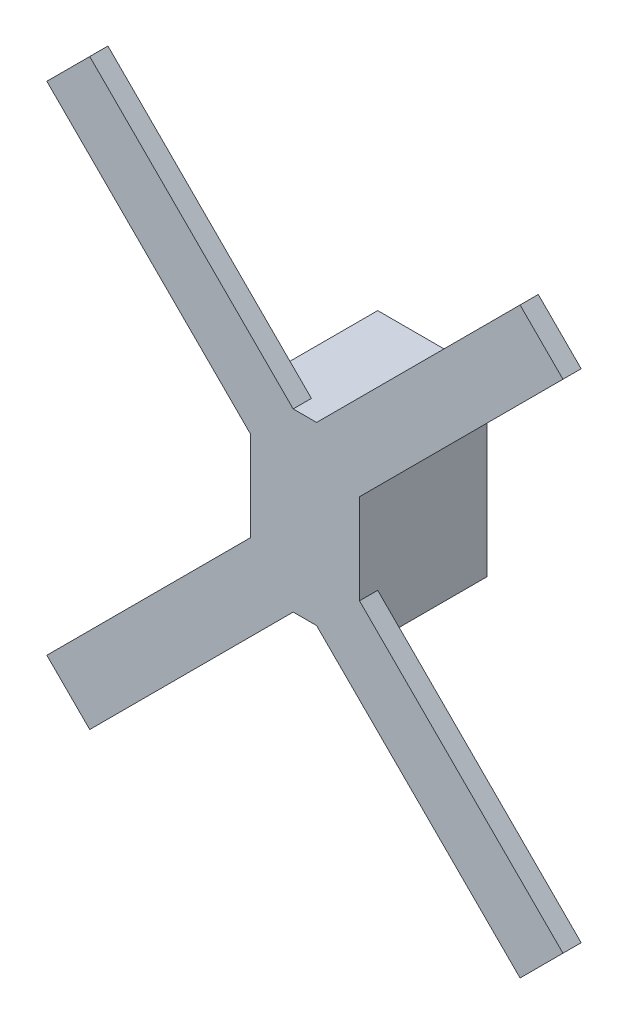
ISO-10303-21;
HEADER;
FILE_DESCRIPTION(('STEP AP214'),'2;1');
FILE_NAME('part.step','',(''),(''),'','','');
FILE_SCHEMA(('AUTOMOTIVE_DESIGN { 1 0 10303 214 1 1 1 1 }'));
ENDSEC;
DATA;
#1=APPLICATION_CONTEXT('core data for automotive mechanical design processes');
#2=APPLICATION_PROTOCOL_DEFINITION('international standard','automotive_design',2000,#1);
#3=PRODUCT_CONTEXT('',#1,'mechanical');
#4=PRODUCT('Part','Part','',(#3));
#5=PRODUCT_RELATED_PRODUCT_CATEGORY('part','',(#4));
#6=PRODUCT_DEFINITION_FORMATION('','',#4);
#7=PRODUCT_DEFINITION_CONTEXT('part definition',#1,'design');
#8=PRODUCT_DEFINITION('design','',#6,#7);
#9=PRODUCT_DEFINITION_SHAPE('','',#8);
#10=(LENGTH_UNIT() NAMED_UNIT(*) SI_UNIT(.MILLI.,.METRE.));
#11=(NAMED_UNIT(*) PLANE_ANGLE_UNIT() SI_UNIT($,.RADIAN.));
#12=(NAMED_UNIT(*) SI_UNIT($,.STERADIAN.) SOLID_ANGLE_UNIT());
#13=UNCERTAINTY_MEASURE_WITH_UNIT(LENGTH_MEASURE(1.E-05),#10,'distance_accuracy_value','');
#14=(GEOMETRIC_REPRESENTATION_CONTEXT(3) GLOBAL_UNCERTAINTY_ASSIGNED_CONTEXT((#13)) GLOBAL_UNIT_ASSIGNED_CONTEXT((#10,
#11,#12)) REPRESENTATION_CONTEXT('',''));
#15=CARTESIAN_POINT('',(0.,0.,0.));
#16=DIRECTION('',(0.,0.,1.));
#17=DIRECTION('',(1.,0.,0.));
#18=AXIS2_PLACEMENT_3D('',#15,#16,#17);
#19=CARTESIAN_POINT('',(-24.2652702511118,-2.501993067591,21.));
#20=DIRECTION('',(1.,0.,0.));
#21=DIRECTION('',(0.,0.,-1.));
#22=AXIS2_PLACEMENT_3D('',#19,#20,#21);
#23=PLANE('',#22);
#24=DIRECTION('',(0.,0.,-1.));
#25=VECTOR('',#24,1.);
#26=CARTESIAN_POINT('',(-24.2652702511118,-2.501993067591,21.));
#27=LINE('',#26,#25);
#28=CARTESIAN_POINT('',(-24.2652702511118,-2.501993067591,19.));
#29=VERTEX_POINT('',#28);
#30=CARTESIAN_POINT('',(-24.2652702511118,-2.501993067591,0.));
#31=VERTEX_POINT('',#30);
#32=EDGE_CURVE('E249',#29,#31,#27,.T.);
#33=ORIENTED_EDGE('',*,*,#32,.F.);
#34=DIRECTION('',(0.,-1.,0.));
#35=VECTOR('',#34,1.);
#36=CARTESIAN_POINT('',(-24.2652702511118,-2.501993067591,19.));
#37=LINE('',#36,#35);
#38=CARTESIAN_POINT('',(-24.2652702511118,-27.501993067591,19.));
#39=VERTEX_POINT('',#38);
#40=EDGE_CURVE('E272',#29,#39,#37,.T.);
#41=ORIENTED_EDGE('',*,*,#40,.T.);
#42=DIRECTION('',(0.,0.,-1.));
#43=VECTOR('',#42,1.);
#44=CARTESIAN_POINT('',(-24.2652702511118,-27.501993067591,21.));
#45=LINE('',#44,#43);
#46=CARTESIAN_POINT('',(-24.2652702511118,-27.501993067591,0.));
#47=VERTEX_POINT('',#46);
#48=EDGE_CURVE('E236',#39,#47,#45,.T.);
#49=ORIENTED_EDGE('',*,*,#48,.T.);
#50=DIRECTION('',(0.,-1.,0.));
#51=VECTOR('',#50,1.);
#52=CARTESIAN_POINT('',(-24.2652702511118,-2.501993067591,0.));
#53=LINE('',#52,#51);
#54=EDGE_CURVE('E260',#31,#47,#53,.T.);
#55=ORIENTED_EDGE('',*,*,#54,.F.);
#56=EDGE_LOOP('',(#33,#41,#49,#55));
#57=FACE_BOUND('',#56,.T.);
#58=ADVANCED_FACE('F33',(#57),#23,.T.);
#59=CARTESIAN_POINT('',(-24.2652702511118,-27.501993067591,21.));
#60=DIRECTION('',(0.,1.,0.));
#61=DIRECTION('',(0.,0.,1.));
#62=AXIS2_PLACEMENT_3D('',#59,#60,#61);
#63=PLANE('',#62);
#64=ORIENTED_EDGE('',*,*,#48,.F.);
#65=DIRECTION('',(1.,0.,0.));
#66=VECTOR('',#65,1.);
#67=CARTESIAN_POINT('',(-24.2652702511118,-27.501993067591,19.));
#68=LINE('',#67,#66);
#69=CARTESIAN_POINT('',(-10.2652702511118,-27.501993067591,19.));
#70=VERTEX_POINT('',#69);
#71=EDGE_CURVE('E269',#39,#70,#68,.T.);
#72=ORIENTED_EDGE('',*,*,#71,.T.);
#73=DIRECTION('',(0.,0.,-1.));
#74=VECTOR('',#73,1.);
#75=CARTESIAN_POINT('',(-10.2652702511118,-27.501993067591,21.));
#76=LINE('',#75,#74);
#77=CARTESIAN_POINT('',(-10.2652702511118,-27.501993067591,0.));
#78=VERTEX_POINT('',#77);
#79=EDGE_CURVE('E245',#70,#78,#76,.T.);
#80=ORIENTED_EDGE('',*,*,#79,.T.);
#81=DIRECTION('',(1.,0.,0.));
#82=VECTOR('',#81,1.);
#83=CARTESIAN_POINT('',(-24.2652702511118,-27.501993067591,0.));
#84=LINE('',#83,#82);
#85=EDGE_CURVE('E257',#47,#78,#84,.T.);
#86=ORIENTED_EDGE('',*,*,#85,.F.);
#87=EDGE_LOOP('',(#64,#72,#80,#86));
#88=FACE_BOUND('',#87,.T.);
#89=ADVANCED_FACE('F462',(#88),#63,.T.);
#90=CARTESIAN_POINT('',(-10.2652702511118,-2.501993067591,21.));
#91=DIRECTION('',(-1.,0.,0.));
#92=DIRECTION('',(0.,-1.,0.));
#93=AXIS2_PLACEMENT_3D('',#90,#91,#92);
#94=PLANE('',#93);
#95=ORIENTED_EDGE('',*,*,#79,.F.);
#96=DIRECTION('',(0.,1.,0.));
#97=VECTOR('',#96,1.);
#98=CARTESIAN_POINT('',(-10.2652702511118,-2.501993067591,19.));
#99=LINE('',#98,#97);
#100=CARTESIAN_POINT('',(-10.2652702511118,-2.501993067591,19.));
#101=VERTEX_POINT('',#100);
#102=EDGE_CURVE('E266',#70,#101,#99,.T.);
#103=ORIENTED_EDGE('',*,*,#102,.T.);
#104=DIRECTION('',(0.,0.,-1.));
#105=VECTOR('',#104,1.);
#106=CARTESIAN_POINT('',(-10.2652702511118,-2.501993067591,21.));
#107=LINE('',#106,#105);
#108=CARTESIAN_POINT('',(-10.2652702511118,-2.501993067591,0.));
#109=VERTEX_POINT('',#108);
#110=EDGE_CURVE('E247',#101,#109,#107,.T.);
#111=ORIENTED_EDGE('',*,*,#110,.T.);
#112=DIRECTION('',(0.,1.,0.));
#113=VECTOR('',#112,1.);
#114=CARTESIAN_POINT('',(-10.2652702511118,-2.501993067591,0.));
#115=LINE('',#114,#113);
#116=EDGE_CURVE('E254',#78,#109,#115,.T.);
#117=ORIENTED_EDGE('',*,*,#116,.F.);
#118=EDGE_LOOP('',(#95,#103,#111,#117));
#119=FACE_BOUND('',#118,.T.);
#120=ADVANCED_FACE('F466',(#119),#94,.T.);
#121=CARTESIAN_POINT('',(-24.2652702511118,-2.501993067591,21.));
#122=DIRECTION('',(0.,-1.,0.));
#123=DIRECTION('',(0.,0.,-1.));
#124=AXIS2_PLACEMENT_3D('',#121,#122,#123);
#125=PLANE('',#124);
#126=ORIENTED_EDGE('',*,*,#110,.F.);
#127=DIRECTION('',(-1.,0.,0.));
#128=VECTOR('',#127,1.);
#129=CARTESIAN_POINT('',(-24.2652702511118,-2.501993067591,19.));
#130=LINE('',#129,#128);
#131=EDGE_CURVE('E263',#101,#29,#130,.T.);
#132=ORIENTED_EDGE('',*,*,#131,.T.);
#133=ORIENTED_EDGE('',*,*,#32,.T.);
#134=DIRECTION('',(-1.,0.,0.));
#135=VECTOR('',#134,1.);
#136=CARTESIAN_POINT('',(-24.2652702511118,-2.501993067591,0.));
#137=LINE('',#136,#135);
#138=EDGE_CURVE('E251',#109,#31,#137,.T.);
#139=ORIENTED_EDGE('',*,*,#138,.F.);
#140=EDGE_LOOP('',(#126,#132,#133,#139));
#141=FACE_BOUND('',#140,.T.);
#142=ADVANCED_FACE('F469',(#141),#125,.T.);
#143=CARTESIAN_POINT('',(0.,0.,21.));
#144=DIRECTION('',(0.,0.,1.));
#145=DIRECTION('',(1.,0.,0.));
#146=AXIS2_PLACEMENT_3D('',#143,#144,#145);
#147=PLANE('',#146);
#148=DIRECTION('',(0.,-1.,0.));
#149=VECTOR('',#148,1.);
#150=CARTESIAN_POINT('',(-26.2652702511118,-2.501993067591,21.));
#151=LINE('',#150,#149);
#152=CARTESIAN_POINT('',(-26.2652702511118,-7.57306087945565,21.));
#153=VERTEX_POINT('',#152);
#154=CARTESIAN_POINT('',(-26.2652702511118,-22.4309252557213,21.));
#155=VERTEX_POINT('',#154);
#156=EDGE_CURVE('E238',#153,#155,#151,.T.);
#157=ORIENTED_EDGE('',*,*,#156,.T.);
#158=DIRECTION('',(-0.707106781186546,-0.707106781186549,0.));
#159=VECTOR('',#158,1.);
#160=CARTESIAN_POINT('',(-59.800804157045,-55.9664591616546,21.));
#161=LINE('',#160,#159);
#162=CARTESIAN_POINT('',(-59.800804157045,-55.9664591616546,21.));
#163=VERTEX_POINT('',#162);
#164=EDGE_CURVE('E381',#155,#163,#161,.T.);
#165=ORIENTED_EDGE('',*,*,#164,.T.);
#166=DIRECTION('',(0.707106781186549,-0.707106781186546,0.));
#167=VECTOR('',#166,1.);
#168=CARTESIAN_POINT('',(-56.265270251112,-59.5019930675874,21.));
#169=LINE('',#168,#167);
#170=CARTESIAN_POINT('',(-52.7297363451791,-63.0375269735203,21.));
#171=VERTEX_POINT('',#170);
#172=EDGE_CURVE('E379',#163,#171,#169,.T.);
#173=ORIENTED_EDGE('',*,*,#172,.T.);
#174=DIRECTION('',(0.707106781186547,0.707106781186548,0.));
#175=VECTOR('',#174,1.);
#176=CARTESIAN_POINT('',(-19.1942024392499,-29.501993067591,21.));
#177=LINE('',#176,#175);
#178=CARTESIAN_POINT('',(-19.1942024392499,-29.501993067591,21.));
#179=VERTEX_POINT('',#178);
#180=EDGE_CURVE('E48',#171,#179,#177,.T.);
#181=ORIENTED_EDGE('',*,*,#180,.T.);
#182=DIRECTION('',(1.,0.,0.));
#183=VECTOR('',#182,1.);
#184=CARTESIAN_POINT('',(-26.2652702511118,-29.501993067591,21.));
#185=LINE('',#184,#183);
#186=CARTESIAN_POINT('',(-15.3363380629771,-29.501993067591,21.));
#187=VERTEX_POINT('',#186);
#188=EDGE_CURVE('E223',#179,#187,#185,.T.);
#189=ORIENTED_EDGE('',*,*,#188,.T.);
#190=DIRECTION('',(0.707106781186548,-0.707106781186547,0.));
#191=VECTOR('',#190,1.);
#192=CARTESIAN_POINT('',(18.1991958429563,-63.0375269735244,21.));
#193=LINE('',#192,#191);
#194=CARTESIAN_POINT('',(18.1991958429563,-63.0375269735244,21.));
#195=VERTEX_POINT('',#194);
#196=EDGE_CURVE('E354',#187,#195,#193,.T.);
#197=ORIENTED_EDGE('',*,*,#196,.T.);
#198=DIRECTION('',(0.707106781186547,0.707106781186548,0.));
#199=VECTOR('',#198,1.);
#200=CARTESIAN_POINT('',(25.2702636548226,-55.966459161658,21.));
#201=LINE('',#200,#199);
#202=CARTESIAN_POINT('',(25.2702636548226,-55.966459161658,21.));
#203=VERTEX_POINT('',#202);
#204=EDGE_CURVE('E351',#195,#203,#201,.T.);
#205=ORIENTED_EDGE('',*,*,#204,.T.);
#206=DIRECTION('',(-0.707106781186548,0.707106781186547,0.));
#207=VECTOR('',#206,1.);
#208=CARTESIAN_POINT('',(25.2702636548226,-55.966459161658,21.));
#209=LINE('',#208,#207);
#210=CARTESIAN_POINT('',(-8.2652702511118,-22.4309252557236,21.));
#211=VERTEX_POINT('',#210);
#212=EDGE_CURVE('E347',#203,#211,#209,.T.);
#213=ORIENTED_EDGE('',*,*,#212,.T.);
#214=DIRECTION('',(0.,1.,0.));
#215=VECTOR('',#214,1.);
#216=CARTESIAN_POINT('',(-8.2652702511118,-29.501993067591,21.));
#217=LINE('',#216,#215);
#218=CARTESIAN_POINT('',(-8.2652702511118,-7.57306087945814,21.));
#219=VERTEX_POINT('',#218);
#220=EDGE_CURVE('E228',#211,#219,#217,.T.);
#221=ORIENTED_EDGE('',*,*,#220,.T.);
#222=DIRECTION('',(0.707106781186548,0.707106781186547,0.));
#223=VECTOR('',#222,1.);
#224=CARTESIAN_POINT('',(25.2702636548226,25.9624730264762,21.));
#225=LINE('',#224,#223);
#226=CARTESIAN_POINT('',(25.2702636548226,25.9624730264762,21.));
#227=VERTEX_POINT('',#226);
#228=EDGE_CURVE('E293',#219,#227,#225,.T.);
#229=ORIENTED_EDGE('',*,*,#228,.T.);
#230=DIRECTION('',(-0.707106781186547,0.707106781186548,0.));
#231=VECTOR('',#230,1.);
#232=CARTESIAN_POINT('',(21.7347297488902,29.4980069324086,21.));
#233=LINE('',#232,#231);
#234=CARTESIAN_POINT('',(18.1991958429563,33.0335408383425,21.));
#235=VERTEX_POINT('',#234);
#236=EDGE_CURVE('E290',#227,#235,#233,.T.);
#237=ORIENTED_EDGE('',*,*,#236,.T.);
#238=DIRECTION('',(-0.707106781186543,-0.707106781186552,0.));
#239=VECTOR('',#238,1.);
#240=CARTESIAN_POINT('',(18.1991958429563,33.0335408383425,21.));
#241=LINE('',#240,#239);
#242=CARTESIAN_POINT('',(-15.3363380629769,-0.501993067591003,21.));
#243=VERTEX_POINT('',#242);
#244=EDGE_CURVE('E287',#235,#243,#241,.T.);
#245=ORIENTED_EDGE('',*,*,#244,.T.);
#246=DIRECTION('',(-1.,0.,0.));
#247=VECTOR('',#246,1.);
#248=CARTESIAN_POINT('',(-8.2652702511118,-0.501993067591003,21.));
#249=LINE('',#248,#247);
#250=CARTESIAN_POINT('',(-19.1942024392448,-0.501993067591003,21.));
#251=VERTEX_POINT('',#250);
#252=EDGE_CURVE('E240',#243,#251,#249,.T.);
#253=ORIENTED_EDGE('',*,*,#252,.T.);
#254=DIRECTION('',(-0.707106781186547,0.707106781186548,0.));
#255=VECTOR('',#254,1.);
#256=CARTESIAN_POINT('',(-52.7297363451782,33.0335408383425,21.));
#257=LINE('',#256,#255);
#258=CARTESIAN_POINT('',(-52.7297363451782,33.0335408383425,21.));
#259=VERTEX_POINT('',#258);
#260=EDGE_CURVE('E322',#251,#259,#257,.T.);
#261=ORIENTED_EDGE('',*,*,#260,.T.);
#262=DIRECTION('',(-0.707106781186548,-0.707106781186548,0.));
#263=VECTOR('',#262,1.);
#264=CARTESIAN_POINT('',(-56.2652702511076,29.4980069324132,21.));
#265=LINE('',#264,#263);
#266=CARTESIAN_POINT('',(-59.8008041570445,25.9624730264762,21.));
#267=VERTEX_POINT('',#266);
#268=EDGE_CURVE('E320',#259,#267,#265,.T.);
#269=ORIENTED_EDGE('',*,*,#268,.T.);
#270=DIRECTION('',(0.707106781186556,-0.707106781186539,0.));
#271=VECTOR('',#270,1.);
#272=CARTESIAN_POINT('',(-59.8008041570445,25.9624730264762,21.));
#273=LINE('',#272,#271);
#274=EDGE_CURVE('E55',#267,#153,#273,.T.);
#275=ORIENTED_EDGE('',*,*,#274,.T.);
#276=EDGE_LOOP('',(#157,#165,#173,#181,#189,#197,#205,#213,#221,#229,#237,#245,#253,#261,#269,#275));
#277=FACE_BOUND('',#276,.T.);
#278=ADVANCED_FACE('F391',(#277),#147,.T.);
#279=CARTESIAN_POINT('',(0.,0.,0.));
#280=DIRECTION('',(0.,0.,1.));
#281=DIRECTION('',(1.,0.,0.));
#282=AXIS2_PLACEMENT_3D('',#279,#280,#281);
#283=PLANE('',#282);
#284=DIRECTION('',(0.,1.,0.));
#285=VECTOR('',#284,1.);
#286=CARTESIAN_POINT('',(-8.2652702511118,-27.501993067591,0.));
#287=LINE('',#286,#285);
#288=CARTESIAN_POINT('',(-8.2652702511118,-29.501993067591,0.));
#289=VERTEX_POINT('',#288);
#290=CARTESIAN_POINT('',(-8.2652702511118,-0.501993067591003,0.));
#291=VERTEX_POINT('',#290);
#292=EDGE_CURVE('E233',#289,#291,#287,.T.);
#293=ORIENTED_EDGE('',*,*,#292,.F.);
#294=DIRECTION('',(1.,0.,0.));
#295=VECTOR('',#294,1.);
#296=CARTESIAN_POINT('',(-10.2652702511118,-29.501993067591,0.));
#297=LINE('',#296,#295);
#298=CARTESIAN_POINT('',(-26.2652702511118,-29.501993067591,0.));
#299=VERTEX_POINT('',#298);
#300=EDGE_CURVE('E226',#299,#289,#297,.T.);
#301=ORIENTED_EDGE('',*,*,#300,.F.);
#302=DIRECTION('',(0.,-1.,0.));
#303=VECTOR('',#302,1.);
#304=CARTESIAN_POINT('',(-26.2652702511118,-2.501993067591,0.));
#305=LINE('',#304,#303);
#306=CARTESIAN_POINT('',(-26.2652702511118,-0.501993067591003,0.));
#307=VERTEX_POINT('',#306);
#308=EDGE_CURVE('E220',#307,#299,#305,.T.);
#309=ORIENTED_EDGE('',*,*,#308,.F.);
#310=DIRECTION('',(-1.,0.,0.));
#311=VECTOR('',#310,1.);
#312=CARTESIAN_POINT('',(-26.2652702511118,-0.501993067591003,0.));
#313=LINE('',#312,#311);
#314=EDGE_CURVE('E230',#291,#307,#313,.T.);
#315=ORIENTED_EDGE('',*,*,#314,.F.);
#316=EDGE_LOOP('',(#293,#301,#309,#315));
#317=FACE_BOUND('',#316,.T.);
#318=ORIENTED_EDGE('',*,*,#54,.T.);
#319=ORIENTED_EDGE('',*,*,#85,.T.);
#320=ORIENTED_EDGE('',*,*,#116,.T.);
#321=ORIENTED_EDGE('',*,*,#138,.T.);
#322=EDGE_LOOP('',(#318,#319,#320,#321));
#323=FACE_BOUND('',#322,.T.);
#324=ADVANCED_FACE('F451',(#317,#323),#283,.F.);
#325=CARTESIAN_POINT('',(-8.2652702511118,-27.501993067591,21.));
#326=DIRECTION('',(-1.,0.,0.));
#327=DIRECTION('',(0.,0.,1.));
#328=AXIS2_PLACEMENT_3D('',#325,#326,#327);
#329=PLANE('',#328);
#330=ORIENTED_EDGE('',*,*,#220,.F.);
#331=DIRECTION('',(0.,0.,1.));
#332=VECTOR('',#331,1.);
#333=CARTESIAN_POINT('',(-8.2652702511118,-22.4309252557236,18.));
#334=LINE('',#333,#332);
#335=CARTESIAN_POINT('',(-8.2652702511118,-22.4309252557236,18.));
#336=VERTEX_POINT('',#335);
#337=EDGE_CURVE('E325',#336,#211,#334,.T.);
#338=ORIENTED_EDGE('',*,*,#337,.F.);
#339=DIRECTION('',(0.,-1.,0.));
#340=VECTOR('',#339,1.);
#341=CARTESIAN_POINT('',(-8.2652702511118,-22.4309252557236,18.));
#342=LINE('',#341,#340);
#343=CARTESIAN_POINT('',(-8.2652702511118,-29.501993067591,18.));
#344=VERTEX_POINT('',#343);
#345=EDGE_CURVE('E350',#336,#344,#342,.T.);
#346=ORIENTED_EDGE('',*,*,#345,.T.);
#347=DIRECTION('',(0.,0.,-1.));
#348=VECTOR('',#347,1.);
#349=CARTESIAN_POINT('',(-8.2652702511118,-29.501993067591,21.));
#350=LINE('',#349,#348);
#351=EDGE_CURVE('E221',#344,#289,#350,.T.);
#352=ORIENTED_EDGE('',*,*,#351,.T.);
#353=ORIENTED_EDGE('',*,*,#292,.T.);
#354=DIRECTION('',(0.,0.,-1.));
#355=VECTOR('',#354,1.);
#356=CARTESIAN_POINT('',(-8.2652702511118,-0.501993067591003,21.));
#357=LINE('',#356,#355);
#358=CARTESIAN_POINT('',(-8.2652702511118,-0.501993067591003,18.));
#359=VERTEX_POINT('',#358);
#360=EDGE_CURVE('E11',#359,#291,#357,.T.);
#361=ORIENTED_EDGE('',*,*,#360,.F.);
#362=DIRECTION('',(0.,-1.,0.));
#363=VECTOR('',#362,1.);
#364=CARTESIAN_POINT('',(-8.2652702511118,-7.57306087945814,18.));
#365=LINE('',#364,#363);
#366=CARTESIAN_POINT('',(-8.2652702511118,-7.57306087945814,18.));
#367=VERTEX_POINT('',#366);
#368=EDGE_CURVE('E289',#359,#367,#365,.T.);
#369=ORIENTED_EDGE('',*,*,#368,.T.);
#370=DIRECTION('',(0.,0.,1.));
#371=VECTOR('',#370,1.);
#372=CARTESIAN_POINT('',(-8.2652702511118,-7.57306087945814,18.));
#373=LINE('',#372,#371);
#374=EDGE_CURVE('E276',#367,#219,#373,.T.);
#375=ORIENTED_EDGE('',*,*,#374,.T.);
#376=EDGE_LOOP('',(#330,#338,#346,#352,#353,#361,#369,#375));
#377=FACE_BOUND('',#376,.T.);
#378=ADVANCED_FACE('F35',(#377),#329,.F.);
#379=CARTESIAN_POINT('',(-26.2652702511118,-0.501993067591003,21.));
#380=DIRECTION('',(0.,-1.,0.));
#381=DIRECTION('',(0.,0.,-1.));
#382=AXIS2_PLACEMENT_3D('',#379,#380,#381);
#383=PLANE('',#382);
#384=DIRECTION('',(1.,0.,0.));
#385=VECTOR('',#384,1.);
#386=CARTESIAN_POINT('',(-26.2652702511118,-0.501993067591003,18.));
#387=LINE('',#386,#385);
#388=CARTESIAN_POINT('',(-26.2652702511118,-0.501993067591003,18.));
#389=VERTEX_POINT('',#388);
#390=CARTESIAN_POINT('',(-19.1942024392448,-0.501993067591003,18.));
#391=VERTEX_POINT('',#390);
#392=EDGE_CURVE('E319',#389,#391,#387,.T.);
#393=ORIENTED_EDGE('',*,*,#392,.T.);
#394=DIRECTION('',(0.,0.,1.));
#395=VECTOR('',#394,1.);
#396=CARTESIAN_POINT('',(-19.1942024392448,-0.501993067591003,18.));
#397=LINE('',#396,#395);
#398=EDGE_CURVE('E308',#391,#251,#397,.T.);
#399=ORIENTED_EDGE('',*,*,#398,.T.);
#400=ORIENTED_EDGE('',*,*,#252,.F.);
#401=DIRECTION('',(0.,0.,1.));
#402=VECTOR('',#401,1.);
#403=CARTESIAN_POINT('',(-15.3363380629769,-0.501993067591003,18.));
#404=LINE('',#403,#402);
#405=CARTESIAN_POINT('',(-15.3363380629769,-0.501993067591003,18.));
#406=VERTEX_POINT('',#405);
#407=EDGE_CURVE('E275',#406,#243,#404,.T.);
#408=ORIENTED_EDGE('',*,*,#407,.F.);
#409=DIRECTION('',(1.,0.,0.));
#410=VECTOR('',#409,1.);
#411=CARTESIAN_POINT('',(-15.3363380629769,-0.501993067591003,18.));
#412=LINE('',#411,#410);
#413=EDGE_CURVE('E280',#406,#359,#412,.T.);
#414=ORIENTED_EDGE('',*,*,#413,.T.);
#415=ORIENTED_EDGE('',*,*,#360,.T.);
#416=ORIENTED_EDGE('',*,*,#314,.T.);
#417=DIRECTION('',(0.,0.,-1.));
#418=VECTOR('',#417,1.);
#419=CARTESIAN_POINT('',(-26.2652702511118,-0.501993067591003,21.));
#420=LINE('',#419,#418);
#421=EDGE_CURVE('E41',#389,#307,#420,.T.);
#422=ORIENTED_EDGE('',*,*,#421,.F.);
#423=EDGE_LOOP('',(#393,#399,#400,#408,#414,#415,#416,#422));
#424=FACE_BOUND('',#423,.T.);
#425=ADVANCED_FACE('F432',(#424),#383,.F.);
#426=CARTESIAN_POINT('',(-26.2652702511118,-2.501993067591,21.));
#427=DIRECTION('',(1.,0.,0.));
#428=DIRECTION('',(0.,0.,-1.));
#429=AXIS2_PLACEMENT_3D('',#426,#427,#428);
#430=PLANE('',#429);
#431=DIRECTION('',(0.,1.,0.));
#432=VECTOR('',#431,1.);
#433=CARTESIAN_POINT('',(-26.2652702511118,-22.4309252557213,18.));
#434=LINE('',#433,#432);
#435=CARTESIAN_POINT('',(-26.2652702511118,-29.501993067591,18.));
#436=VERTEX_POINT('',#435);
#437=CARTESIAN_POINT('',(-26.2652702511118,-22.4309252557213,18.));
#438=VERTEX_POINT('',#437);
#439=EDGE_CURVE('E195',#436,#438,#434,.T.);
#440=ORIENTED_EDGE('',*,*,#439,.T.);
#441=DIRECTION('',(0.,0.,1.));
#442=VECTOR('',#441,1.);
#443=CARTESIAN_POINT('',(-26.2652702511118,-22.4309252557213,18.));
#444=LINE('',#443,#442);
#445=EDGE_CURVE('E369',#438,#155,#444,.T.);
#446=ORIENTED_EDGE('',*,*,#445,.T.);
#447=ORIENTED_EDGE('',*,*,#156,.F.);
#448=DIRECTION('',(0.,0.,1.));
#449=VECTOR('',#448,1.);
#450=CARTESIAN_POINT('',(-26.2652702511118,-7.57306087945565,18.));
#451=LINE('',#450,#449);
#452=CARTESIAN_POINT('',(-26.2652702511118,-7.57306087945565,18.));
#453=VERTEX_POINT('',#452);
#454=EDGE_CURVE('E296',#453,#153,#451,.T.);
#455=ORIENTED_EDGE('',*,*,#454,.F.);
#456=DIRECTION('',(0.,1.,0.));
#457=VECTOR('',#456,1.);
#458=CARTESIAN_POINT('',(-26.2652702511118,-7.57306087945565,18.));
#459=LINE('',#458,#457);
#460=EDGE_CURVE('E312',#453,#389,#459,.T.);
#461=ORIENTED_EDGE('',*,*,#460,.T.);
#462=ORIENTED_EDGE('',*,*,#421,.T.);
#463=ORIENTED_EDGE('',*,*,#308,.T.);
#464=DIRECTION('',(0.,0.,-1.));
#465=VECTOR('',#464,1.);
#466=CARTESIAN_POINT('',(-26.2652702511118,-29.501993067591,21.));
#467=LINE('',#466,#465);
#468=EDGE_CURVE('E213',#436,#299,#467,.T.);
#469=ORIENTED_EDGE('',*,*,#468,.F.);
#470=EDGE_LOOP('',(#440,#446,#447,#455,#461,#462,#463,#469));
#471=FACE_BOUND('',#470,.T.);
#472=ADVANCED_FACE('F218',(#471),#430,.F.);
#473=CARTESIAN_POINT('',(-10.2652702511118,-29.501993067591,21.));
#474=DIRECTION('',(0.,1.,0.));
#475=DIRECTION('',(0.,0.,1.));
#476=AXIS2_PLACEMENT_3D('',#473,#474,#475);
#477=PLANE('',#476);
#478=ORIENTED_EDGE('',*,*,#188,.F.);
#479=DIRECTION('',(0.,0.,1.));
#480=VECTOR('',#479,1.);
#481=CARTESIAN_POINT('',(-19.1942024392499,-29.501993067591,18.));
#482=LINE('',#481,#480);
#483=CARTESIAN_POINT('',(-19.1942024392499,-29.501993067591,18.));
#484=VERTEX_POINT('',#483);
#485=EDGE_CURVE('E215',#484,#179,#482,.T.);
#486=ORIENTED_EDGE('',*,*,#485,.F.);
#487=DIRECTION('',(-1.,0.,0.));
#488=VECTOR('',#487,1.);
#489=CARTESIAN_POINT('',(-19.1942024392499,-29.501993067591,18.));
#490=LINE('',#489,#488);
#491=EDGE_CURVE('E199',#484,#436,#490,.T.);
#492=ORIENTED_EDGE('',*,*,#491,.T.);
#493=ORIENTED_EDGE('',*,*,#468,.T.);
#494=ORIENTED_EDGE('',*,*,#300,.T.);
#495=ORIENTED_EDGE('',*,*,#351,.F.);
#496=DIRECTION('',(-1.,0.,0.));
#497=VECTOR('',#496,1.);
#498=CARTESIAN_POINT('',(-15.3363380629771,-29.501993067591,18.));
#499=LINE('',#498,#497);
#500=CARTESIAN_POINT('',(-15.3363380629771,-29.501993067591,18.));
#501=VERTEX_POINT('',#500);
#502=EDGE_CURVE('E364',#344,#501,#499,.T.);
#503=ORIENTED_EDGE('',*,*,#502,.T.);
#504=DIRECTION('',(0.,0.,1.));
#505=VECTOR('',#504,1.);
#506=CARTESIAN_POINT('',(-15.3363380629771,-29.501993067591,18.));
#507=LINE('',#506,#505);
#508=EDGE_CURVE('E337',#501,#187,#507,.T.);
#509=ORIENTED_EDGE('',*,*,#508,.T.);
#510=EDGE_LOOP('',(#478,#486,#492,#493,#494,#495,#503,#509));
#511=FACE_BOUND('',#510,.T.);
#512=ADVANCED_FACE('F211',(#511),#477,.F.);
#513=CARTESIAN_POINT('',(0.,0.,19.));
#514=DIRECTION('',(0.,0.,1.));
#515=DIRECTION('',(1.,0.,0.));
#516=AXIS2_PLACEMENT_3D('',#513,#514,#515);
#517=PLANE('',#516);
#518=ORIENTED_EDGE('',*,*,#40,.F.);
#519=ORIENTED_EDGE('',*,*,#131,.F.);
#520=ORIENTED_EDGE('',*,*,#102,.F.);
#521=ORIENTED_EDGE('',*,*,#71,.F.);
#522=EDGE_LOOP('',(#518,#519,#520,#521));
#523=FACE_BOUND('',#522,.T.);
#524=ADVANCED_FACE('F471',(#523),#517,.F.);
#525=CARTESIAN_POINT('',(18.1991958429563,33.0335408383425,18.));
#526=DIRECTION('',(-0.707106781186552,0.707106781186543,0.));
#527=DIRECTION('',(-0.707106781186543,-0.707106781186552,0.));
#528=AXIS2_PLACEMENT_3D('',#525,#526,#527);
#529=PLANE('',#528);
#530=ORIENTED_EDGE('',*,*,#244,.F.);
#531=DIRECTION('',(0.,0.,1.));
#532=VECTOR('',#531,1.);
#533=CARTESIAN_POINT('',(18.1991958429563,33.0335408383425,18.));
#534=LINE('',#533,#532);
#535=CARTESIAN_POINT('',(18.1991958429563,33.0335408383425,18.));
#536=VERTEX_POINT('',#535);
#537=EDGE_CURVE('E283',#536,#235,#534,.T.);
#538=ORIENTED_EDGE('',*,*,#537,.F.);
#539=DIRECTION('',(-0.707106781186543,-0.707106781186552,0.));
#540=VECTOR('',#539,1.);
#541=CARTESIAN_POINT('',(18.1991958429563,33.0335408383425,18.));
#542=LINE('',#541,#540);
#543=EDGE_CURVE('E299',#536,#406,#542,.T.);
#544=ORIENTED_EDGE('',*,*,#543,.T.);
#545=ORIENTED_EDGE('',*,*,#407,.T.);
#546=EDGE_LOOP('',(#530,#538,#544,#545));
#547=FACE_BOUND('',#546,.T.);
#548=ADVANCED_FACE('F429',(#547),#529,.T.);
#549=CARTESIAN_POINT('',(21.7347297488902,29.4980069324086,18.));
#550=DIRECTION('',(0.707106781186548,0.707106781186547,0.));
#551=DIRECTION('',(-0.707106781186547,0.707106781186548,0.));
#552=AXIS2_PLACEMENT_3D('',#549,#550,#551);
#553=PLANE('',#552);
#554=ORIENTED_EDGE('',*,*,#236,.F.);
#555=DIRECTION('',(0.,0.,1.));
#556=VECTOR('',#555,1.);
#557=CARTESIAN_POINT('',(25.2702636548226,25.9624730264762,18.));
#558=LINE('',#557,#556);
#559=CARTESIAN_POINT('',(25.2702636548226,25.9624730264762,18.));
#560=VERTEX_POINT('',#559);
#561=EDGE_CURVE('E279',#560,#227,#558,.T.);
#562=ORIENTED_EDGE('',*,*,#561,.F.);
#563=DIRECTION('',(-0.707106781186552,0.707106781186543,0.));
#564=VECTOR('',#563,1.);
#565=CARTESIAN_POINT('',(21.7347297488902,29.4980069324086,18.));
#566=LINE('',#565,#564);
#567=EDGE_CURVE('E301',#560,#536,#566,.T.);
#568=ORIENTED_EDGE('',*,*,#567,.T.);
#569=ORIENTED_EDGE('',*,*,#537,.T.);
#570=EDGE_LOOP('',(#554,#562,#568,#569));
#571=FACE_BOUND('',#570,.T.);
#572=ADVANCED_FACE('F420',(#571),#553,.T.);
#573=CARTESIAN_POINT('',(25.2702636548226,25.9624730264762,18.));
#574=DIRECTION('',(0.707106781186547,-0.707106781186548,0.));
#575=DIRECTION('',(0.707106781186548,0.707106781186547,0.));
#576=AXIS2_PLACEMENT_3D('',#573,#574,#575);
#577=PLANE('',#576);
#578=ORIENTED_EDGE('',*,*,#228,.F.);
#579=ORIENTED_EDGE('',*,*,#374,.F.);
#580=DIRECTION('',(0.707106781186548,0.707106781186547,0.));
#581=VECTOR('',#580,1.);
#582=CARTESIAN_POINT('',(25.2702636548226,25.9624730264762,18.));
#583=LINE('',#582,#581);
#584=EDGE_CURVE('E303',#367,#560,#583,.T.);
#585=ORIENTED_EDGE('',*,*,#584,.T.);
#586=ORIENTED_EDGE('',*,*,#561,.T.);
#587=EDGE_LOOP('',(#578,#579,#585,#586));
#588=FACE_BOUND('',#587,.T.);
#589=ADVANCED_FACE('F416',(#588),#577,.T.);
#590=CARTESIAN_POINT('',(0.,0.,18.));
#591=DIRECTION('',(0.,0.,-1.));
#592=DIRECTION('',(-1.,0.,0.));
#593=AXIS2_PLACEMENT_3D('',#590,#591,#592);
#594=PLANE('',#593);
#595=ORIENTED_EDGE('',*,*,#368,.F.);
#596=ORIENTED_EDGE('',*,*,#413,.F.);
#597=ORIENTED_EDGE('',*,*,#543,.F.);
#598=ORIENTED_EDGE('',*,*,#567,.F.);
#599=ORIENTED_EDGE('',*,*,#584,.F.);
#600=EDGE_LOOP('',(#595,#596,#597,#598,#599));
#601=FACE_BOUND('',#600,.T.);
#602=ADVANCED_FACE('F424',(#601),#594,.T.);
#603=CARTESIAN_POINT('',(-59.8008041570445,25.9624730264762,18.));
#604=DIRECTION('',(-0.707106781186539,-0.707106781186556,0.));
#605=DIRECTION('',(0.707106781186556,-0.707106781186539,0.));
#606=AXIS2_PLACEMENT_3D('',#603,#604,#605);
#607=PLANE('',#606);
#608=ORIENTED_EDGE('',*,*,#274,.F.);
#609=DIRECTION('',(0.,0.,1.));
#610=VECTOR('',#609,1.);
#611=CARTESIAN_POINT('',(-59.8008041570445,25.9624730264762,18.));
#612=LINE('',#611,#610);
#613=CARTESIAN_POINT('',(-59.8008041570445,25.9624730264762,18.));
#614=VERTEX_POINT('',#613);
#615=EDGE_CURVE('E315',#614,#267,#612,.T.);
#616=ORIENTED_EDGE('',*,*,#615,.F.);
#617=DIRECTION('',(0.707106781186556,-0.707106781186539,0.));
#618=VECTOR('',#617,1.);
#619=CARTESIAN_POINT('',(-59.8008041570445,25.9624730264762,18.));
#620=LINE('',#619,#618);
#621=EDGE_CURVE('E328',#614,#453,#620,.T.);
#622=ORIENTED_EDGE('',*,*,#621,.T.);
#623=ORIENTED_EDGE('',*,*,#454,.T.);
#624=EDGE_LOOP('',(#608,#616,#622,#623));
#625=FACE_BOUND('',#624,.T.);
#626=ADVANCED_FACE('F446',(#625),#607,.T.);
#627=CARTESIAN_POINT('',(-56.2652702511076,29.4980069324132,18.));
#628=DIRECTION('',(-0.707106781186547,0.707106781186547,0.));
#629=DIRECTION('',(-0.707106781186548,-0.707106781186548,0.));
#630=AXIS2_PLACEMENT_3D('',#627,#628,#629);
#631=PLANE('',#630);
#632=ORIENTED_EDGE('',*,*,#268,.F.);
#633=DIRECTION('',(0.,0.,1.));
#634=VECTOR('',#633,1.);
#635=CARTESIAN_POINT('',(-52.7297363451782,33.0335408383425,18.));
#636=LINE('',#635,#634);
#637=CARTESIAN_POINT('',(-52.7297363451782,33.0335408383425,18.));
#638=VERTEX_POINT('',#637);
#639=EDGE_CURVE('E311',#638,#259,#636,.T.);
#640=ORIENTED_EDGE('',*,*,#639,.F.);
#641=DIRECTION('',(-0.707106781186548,-0.707106781186548,0.));
#642=VECTOR('',#641,1.);
#643=CARTESIAN_POINT('',(-56.2652702511076,29.4980069324132,18.));
#644=LINE('',#643,#642);
#645=EDGE_CURVE('E330',#638,#614,#644,.T.);
#646=ORIENTED_EDGE('',*,*,#645,.T.);
#647=ORIENTED_EDGE('',*,*,#615,.T.);
#648=EDGE_LOOP('',(#632,#640,#646,#647));
#649=FACE_BOUND('',#648,.T.);
#650=ADVANCED_FACE('F444',(#649),#631,.T.);
#651=CARTESIAN_POINT('',(-52.7297363451782,33.0335408383425,18.));
#652=DIRECTION('',(0.707106781186548,0.707106781186547,0.));
#653=DIRECTION('',(-0.707106781186547,0.707106781186548,0.));
#654=AXIS2_PLACEMENT_3D('',#651,#652,#653);
#655=PLANE('',#654);
#656=ORIENTED_EDGE('',*,*,#260,.F.);
#657=ORIENTED_EDGE('',*,*,#398,.F.);
#658=DIRECTION('',(-0.707106781186547,0.707106781186548,0.));
#659=VECTOR('',#658,1.);
#660=CARTESIAN_POINT('',(-52.7297363451782,33.0335408383425,18.));
#661=LINE('',#660,#659);
#662=EDGE_CURVE('E332',#391,#638,#661,.T.);
#663=ORIENTED_EDGE('',*,*,#662,.T.);
#664=ORIENTED_EDGE('',*,*,#639,.T.);
#665=EDGE_LOOP('',(#656,#657,#663,#664));
#666=FACE_BOUND('',#665,.T.);
#667=ADVANCED_FACE('F436',(#666),#655,.T.);
#668=CARTESIAN_POINT('',(0.,0.,18.));
#669=DIRECTION('',(0.,0.,1.));
#670=DIRECTION('',(1.,0.,0.));
#671=AXIS2_PLACEMENT_3D('',#668,#669,#670);
#672=PLANE('',#671);
#673=ORIENTED_EDGE('',*,*,#392,.F.);
#674=ORIENTED_EDGE('',*,*,#460,.F.);
#675=ORIENTED_EDGE('',*,*,#621,.F.);
#676=ORIENTED_EDGE('',*,*,#645,.F.);
#677=ORIENTED_EDGE('',*,*,#662,.F.);
#678=EDGE_LOOP('',(#673,#674,#675,#676,#677));
#679=FACE_BOUND('',#678,.T.);
#680=ADVANCED_FACE('F439',(#679),#672,.F.);
#681=CARTESIAN_POINT('',(25.2702636548226,-55.966459161658,18.));
#682=DIRECTION('',(0.707106781186547,0.707106781186548,0.));
#683=DIRECTION('',(-0.707106781186548,0.707106781186547,0.));
#684=AXIS2_PLACEMENT_3D('',#681,#682,#683);
#685=PLANE('',#684);
#686=ORIENTED_EDGE('',*,*,#212,.F.);
#687=DIRECTION('',(0.,0.,1.));
#688=VECTOR('',#687,1.);
#689=CARTESIAN_POINT('',(25.2702636548226,-55.966459161658,18.));
#690=LINE('',#689,#688);
#691=CARTESIAN_POINT('',(25.2702636548226,-55.966459161658,18.));
#692=VERTEX_POINT('',#691);
#693=EDGE_CURVE('E344',#692,#203,#690,.T.);
#694=ORIENTED_EDGE('',*,*,#693,.F.);
#695=DIRECTION('',(-0.707106781186548,0.707106781186547,0.));
#696=VECTOR('',#695,1.);
#697=CARTESIAN_POINT('',(25.2702636548226,-55.966459161658,18.));
#698=LINE('',#697,#696);
#699=EDGE_CURVE('E341',#692,#336,#698,.T.);
#700=ORIENTED_EDGE('',*,*,#699,.T.);
#701=ORIENTED_EDGE('',*,*,#337,.T.);
#702=EDGE_LOOP('',(#686,#694,#700,#701));
#703=FACE_BOUND('',#702,.T.);
#704=ADVANCED_FACE('F410',(#703),#685,.T.);
#705=CARTESIAN_POINT('',(25.2702636548226,-55.966459161658,18.));
#706=DIRECTION('',(0.707106781186548,-0.707106781186547,0.));
#707=DIRECTION('',(0.707106781186547,0.707106781186548,0.));
#708=AXIS2_PLACEMENT_3D('',#705,#706,#707);
#709=PLANE('',#708);
#710=ORIENTED_EDGE('',*,*,#204,.F.);
#711=DIRECTION('',(0.,0.,1.));
#712=VECTOR('',#711,1.);
#713=CARTESIAN_POINT('',(18.1991958429563,-63.0375269735244,18.));
#714=LINE('',#713,#712);
#715=CARTESIAN_POINT('',(18.1991958429563,-63.0375269735244,18.));
#716=VERTEX_POINT('',#715);
#717=EDGE_CURVE('E340',#716,#195,#714,.T.);
#718=ORIENTED_EDGE('',*,*,#717,.F.);
#719=DIRECTION('',(0.707106781186547,0.707106781186548,0.));
#720=VECTOR('',#719,1.);
#721=CARTESIAN_POINT('',(18.1991958429563,-63.0375269735244,18.));
#722=LINE('',#721,#720);
#723=EDGE_CURVE('E359',#716,#692,#722,.T.);
#724=ORIENTED_EDGE('',*,*,#723,.T.);
#725=ORIENTED_EDGE('',*,*,#693,.T.);
#726=EDGE_LOOP('',(#710,#718,#724,#725));
#727=FACE_BOUND('',#726,.T.);
#728=ADVANCED_FACE('F402',(#727),#709,.T.);
#729=CARTESIAN_POINT('',(18.1991958429563,-63.0375269735244,18.));
#730=DIRECTION('',(-0.707106781186547,-0.707106781186548,0.));
#731=DIRECTION('',(0.707106781186548,-0.707106781186547,0.));
#732=AXIS2_PLACEMENT_3D('',#729,#730,#731);
#733=PLANE('',#732);
#734=ORIENTED_EDGE('',*,*,#196,.F.);
#735=ORIENTED_EDGE('',*,*,#508,.F.);
#736=DIRECTION('',(0.707106781186548,-0.707106781186547,0.));
#737=VECTOR('',#736,1.);
#738=CARTESIAN_POINT('',(18.1991958429563,-63.0375269735244,18.));
#739=LINE('',#738,#737);
#740=EDGE_CURVE('E361',#501,#716,#739,.T.);
#741=ORIENTED_EDGE('',*,*,#740,.T.);
#742=ORIENTED_EDGE('',*,*,#717,.T.);
#743=EDGE_LOOP('',(#734,#735,#741,#742));
#744=FACE_BOUND('',#743,.T.);
#745=ADVANCED_FACE('F398',(#744),#733,.T.);
#746=CARTESIAN_POINT('',(0.,0.,18.));
#747=DIRECTION('',(0.,0.,1.));
#748=DIRECTION('',(1.,0.,0.));
#749=AXIS2_PLACEMENT_3D('',#746,#747,#748);
#750=PLANE('',#749);
#751=ORIENTED_EDGE('',*,*,#345,.F.);
#752=ORIENTED_EDGE('',*,*,#699,.F.);
#753=ORIENTED_EDGE('',*,*,#723,.F.);
#754=ORIENTED_EDGE('',*,*,#740,.F.);
#755=ORIENTED_EDGE('',*,*,#502,.F.);
#756=EDGE_LOOP('',(#751,#752,#753,#754,#755));
#757=FACE_BOUND('',#756,.T.);
#758=ADVANCED_FACE('F406',(#757),#750,.F.);
#759=CARTESIAN_POINT('',(-19.1942024392499,-29.501993067591,18.));
#760=DIRECTION('',(0.707106781186548,-0.707106781186547,0.));
#761=DIRECTION('',(0.707106781186547,0.707106781186548,0.));
#762=AXIS2_PLACEMENT_3D('',#759,#760,#761);
#763=PLANE('',#762);
#764=ORIENTED_EDGE('',*,*,#180,.F.);
#765=DIRECTION('',(0.,0.,1.));
#766=VECTOR('',#765,1.);
#767=CARTESIAN_POINT('',(-52.7297363451791,-63.0375269735203,18.));
#768=LINE('',#767,#766);
#769=CARTESIAN_POINT('',(-52.7297363451791,-63.0375269735203,18.));
#770=VERTEX_POINT('',#769);
#771=EDGE_CURVE('E375',#770,#171,#768,.T.);
#772=ORIENTED_EDGE('',*,*,#771,.F.);
#773=DIRECTION('',(0.707106781186547,0.707106781186548,0.));
#774=VECTOR('',#773,1.);
#775=CARTESIAN_POINT('',(-19.1942024392499,-29.501993067591,18.));
#776=LINE('',#775,#774);
#777=EDGE_CURVE('E372',#770,#484,#776,.T.);
#778=ORIENTED_EDGE('',*,*,#777,.T.);
#779=ORIENTED_EDGE('',*,*,#485,.T.);
#780=EDGE_LOOP('',(#764,#772,#778,#779));
#781=FACE_BOUND('',#780,.T.);
#782=ADVANCED_FACE('F395',(#781),#763,.T.);
#783=CARTESIAN_POINT('',(-56.265270251112,-59.5019930675874,18.));
#784=DIRECTION('',(-0.707106781186546,-0.707106781186549,0.));
#785=DIRECTION('',(0.707106781186549,-0.707106781186546,0.));
#786=AXIS2_PLACEMENT_3D('',#783,#784,#785);
#787=PLANE('',#786);
#788=ORIENTED_EDGE('',*,*,#172,.F.);
#789=DIRECTION('',(0.,0.,1.));
#790=VECTOR('',#789,1.);
#791=CARTESIAN_POINT('',(-59.800804157045,-55.9664591616546,18.));
#792=LINE('',#791,#790);
#793=CARTESIAN_POINT('',(-59.800804157045,-55.9664591616546,18.));
#794=VERTEX_POINT('',#793);
#795=EDGE_CURVE('E371',#794,#163,#792,.T.);
#796=ORIENTED_EDGE('',*,*,#795,.F.);
#797=DIRECTION('',(0.70710678118657,-0.707106781186525,0.));
#798=VECTOR('',#797,1.);
#799=CARTESIAN_POINT('',(-56.265270251112,-59.5019930675874,18.));
#800=LINE('',#799,#798);
#801=EDGE_CURVE('E385',#794,#770,#800,.T.);
#802=ORIENTED_EDGE('',*,*,#801,.T.);
#803=ORIENTED_EDGE('',*,*,#771,.T.);
#804=EDGE_LOOP('',(#788,#796,#802,#803));
#805=FACE_BOUND('',#804,.T.);
#806=ADVANCED_FACE('F647',(#805),#787,.T.);
#807=CARTESIAN_POINT('',(-59.800804157045,-55.9664591616546,18.));
#808=DIRECTION('',(-0.707106781186549,0.707106781186546,0.));
#809=DIRECTION('',(-0.707106781186546,-0.707106781186549,0.));
#810=AXIS2_PLACEMENT_3D('',#807,#808,#809);
#811=PLANE('',#810);
#812=ORIENTED_EDGE('',*,*,#164,.F.);
#813=ORIENTED_EDGE('',*,*,#445,.F.);
#814=DIRECTION('',(-0.707106781186546,-0.707106781186549,0.));
#815=VECTOR('',#814,1.);
#816=CARTESIAN_POINT('',(-59.800804157045,-55.9664591616546,18.));
#817=LINE('',#816,#815);
#818=EDGE_CURVE('E203',#438,#794,#817,.T.);
#819=ORIENTED_EDGE('',*,*,#818,.T.);
#820=ORIENTED_EDGE('',*,*,#795,.T.);
#821=EDGE_LOOP('',(#812,#813,#819,#820));
#822=FACE_BOUND('',#821,.T.);
#823=ADVANCED_FACE('F388',(#822),#811,.T.);
#824=CARTESIAN_POINT('',(0.,0.,18.));
#825=DIRECTION('',(0.,0.,1.));
#826=DIRECTION('',(1.,0.,0.));
#827=AXIS2_PLACEMENT_3D('',#824,#825,#826);
#828=PLANE('',#827);
#829=ORIENTED_EDGE('',*,*,#491,.F.);
#830=ORIENTED_EDGE('',*,*,#777,.F.);
#831=ORIENTED_EDGE('',*,*,#801,.F.);
#832=ORIENTED_EDGE('',*,*,#818,.F.);
#833=ORIENTED_EDGE('',*,*,#439,.F.);
#834=EDGE_LOOP('',(#829,#830,#831,#832,#833));
#835=FACE_BOUND('',#834,.T.);
#836=ADVANCED_FACE('F197',(#835),#828,.F.);
#837=CLOSED_SHELL('',(#58,#89,#120,#142,#278,#324,#378,#425,#472,#512,#524,#548,#572,#589,#602,
#626,#650,#667,#680,#704,#728,#745,#758,#782,#806,#823,#836));
#838=MANIFOLD_SOLID_BREP('B2',#837);
#839=ADVANCED_BREP_SHAPE_REPRESENTATION('',(#18,#838),#14);
#840=SHAPE_DEFINITION_REPRESENTATION(#9,#839);
ENDSEC;
END-ISO-10303-21;
